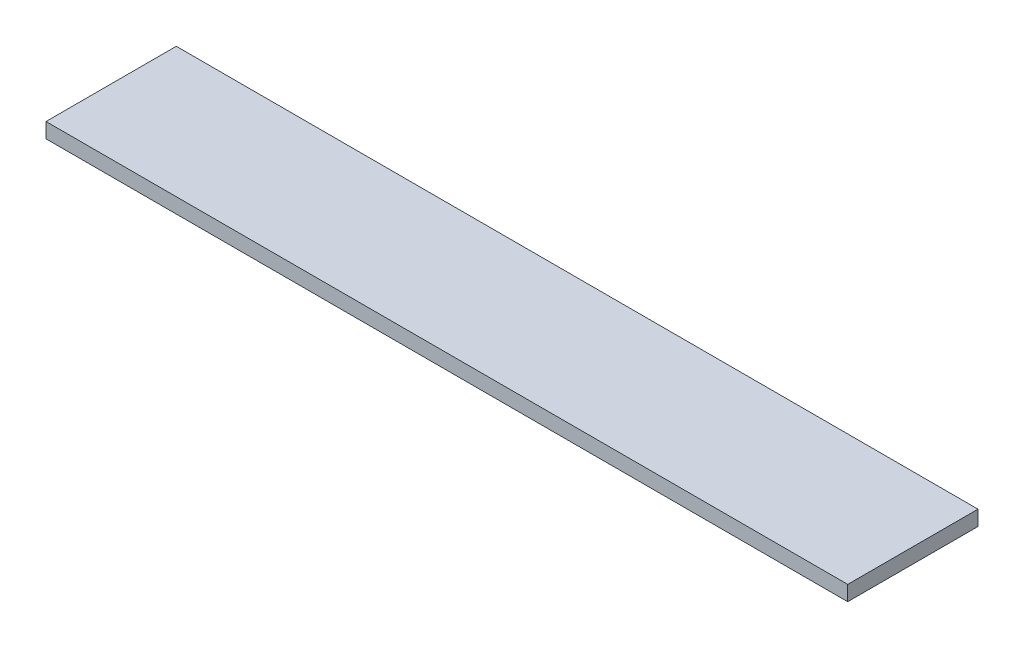
ISO-10303-21;
HEADER;
FILE_DESCRIPTION(('STEP AP214'),'2;1');
FILE_NAME('part.step','',(''),(''),'','','');
FILE_SCHEMA(('AUTOMOTIVE_DESIGN { 1 0 10303 214 1 1 1 1 }'));
ENDSEC;
DATA;
#1=APPLICATION_CONTEXT('core data for automotive mechanical design processes');
#2=APPLICATION_PROTOCOL_DEFINITION('international standard','automotive_design',2000,#1);
#3=PRODUCT_CONTEXT('',#1,'mechanical');
#4=PRODUCT('Part','Part','',(#3));
#5=PRODUCT_RELATED_PRODUCT_CATEGORY('part','',(#4));
#6=PRODUCT_DEFINITION_FORMATION('','',#4);
#7=PRODUCT_DEFINITION_CONTEXT('part definition',#1,'design');
#8=PRODUCT_DEFINITION('design','',#6,#7);
#9=PRODUCT_DEFINITION_SHAPE('','',#8);
#10=(LENGTH_UNIT() NAMED_UNIT(*) SI_UNIT(.MILLI.,.METRE.));
#11=(NAMED_UNIT(*) PLANE_ANGLE_UNIT() SI_UNIT($,.RADIAN.));
#12=(NAMED_UNIT(*) SI_UNIT($,.STERADIAN.) SOLID_ANGLE_UNIT());
#13=UNCERTAINTY_MEASURE_WITH_UNIT(LENGTH_MEASURE(1.E-05),#10,'distance_accuracy_value','');
#14=(GEOMETRIC_REPRESENTATION_CONTEXT(3) GLOBAL_UNCERTAINTY_ASSIGNED_CONTEXT((#13)) GLOBAL_UNIT_ASSIGNED_CONTEXT((#10,
#11,#12)) REPRESENTATION_CONTEXT('',''));
#15=CARTESIAN_POINT('',(0.,0.,0.));
#16=DIRECTION('',(0.,0.,1.));
#17=DIRECTION('',(1.,0.,0.));
#18=AXIS2_PLACEMENT_3D('',#15,#16,#17);
#19=CARTESIAN_POINT('',(-143.80515849099,19.05,936.480181370769));
#20=DIRECTION('',(1.,0.,0.));
#21=DIRECTION('',(0.,0.,-1.));
#22=AXIS2_PLACEMENT_3D('',#19,#20,#21);
#23=PLANE('',#22);
#24=DIRECTION('',(0.,0.,1.));
#25=VECTOR('',#24,1.);
#26=CARTESIAN_POINT('',(-143.80515849099,0.,936.480181370769));
#27=LINE('',#26,#25);
#28=CARTESIAN_POINT('',(-143.80515849099,0.,771.380181370769));
#29=VERTEX_POINT('',#28);
#30=CARTESIAN_POINT('',(-143.80515849099,0.,936.480181370769));
#31=VERTEX_POINT('',#30);
#32=EDGE_CURVE('E99',#29,#31,#27,.T.);
#33=ORIENTED_EDGE('',*,*,#32,.T.);
#34=DIRECTION('',(0.,-1.,0.));
#35=VECTOR('',#34,1.);
#36=CARTESIAN_POINT('',(-143.80515849099,19.05,936.480181370769));
#37=LINE('',#36,#35);
#38=CARTESIAN_POINT('',(-143.80515849099,19.05,936.480181370769));
#39=VERTEX_POINT('',#38);
#40=EDGE_CURVE('E11',#39,#31,#37,.T.);
#41=ORIENTED_EDGE('',*,*,#40,.F.);
#42=DIRECTION('',(0.,0.,1.));
#43=VECTOR('',#42,1.);
#44=CARTESIAN_POINT('',(-143.80515849099,19.05,936.480181370769));
#45=LINE('',#44,#43);
#46=CARTESIAN_POINT('',(-143.80515849099,19.05,771.380181370769));
#47=VERTEX_POINT('',#46);
#48=EDGE_CURVE('E86',#47,#39,#45,.T.);
#49=ORIENTED_EDGE('',*,*,#48,.F.);
#50=DIRECTION('',(0.,-1.,0.));
#51=VECTOR('',#50,1.);
#52=CARTESIAN_POINT('',(-143.80515849099,19.05,771.380181370769));
#53=LINE('',#52,#51);
#54=EDGE_CURVE('E95',#47,#29,#53,.T.);
#55=ORIENTED_EDGE('',*,*,#54,.T.);
#56=EDGE_LOOP('',(#33,#41,#49,#55));
#57=FACE_BOUND('',#56,.T.);
#58=ADVANCED_FACE('F34',(#57),#23,.F.);
#59=CARTESIAN_POINT('',(-143.80515849099,19.05,936.480181370769));
#60=DIRECTION('',(0.,0.,-1.));
#61=DIRECTION('',(-1.,0.,0.));
#62=AXIS2_PLACEMENT_3D('',#59,#60,#61);
#63=PLANE('',#62);
#64=DIRECTION('',(1.,0.,0.));
#65=VECTOR('',#64,1.);
#66=CARTESIAN_POINT('',(-143.80515849099,0.,936.480181370769));
#67=LINE('',#66,#65);
#68=CARTESIAN_POINT('',(872.19484150901,0.,936.480181370769));
#69=VERTEX_POINT('',#68);
#70=EDGE_CURVE('E90',#31,#69,#67,.T.);
#71=ORIENTED_EDGE('',*,*,#70,.T.);
#72=DIRECTION('',(0.,-1.,0.));
#73=VECTOR('',#72,1.);
#74=CARTESIAN_POINT('',(872.19484150901,19.05,936.480181370769));
#75=LINE('',#74,#73);
#76=CARTESIAN_POINT('',(872.19484150901,19.05,936.480181370769));
#77=VERTEX_POINT('',#76);
#78=EDGE_CURVE('E43',#77,#69,#75,.T.);
#79=ORIENTED_EDGE('',*,*,#78,.F.);
#80=DIRECTION('',(1.,0.,0.));
#81=VECTOR('',#80,1.);
#82=CARTESIAN_POINT('',(-143.80515849099,19.05,936.480181370769));
#83=LINE('',#82,#81);
#84=EDGE_CURVE('E81',#39,#77,#83,.T.);
#85=ORIENTED_EDGE('',*,*,#84,.F.);
#86=ORIENTED_EDGE('',*,*,#40,.T.);
#87=EDGE_LOOP('',(#71,#79,#85,#86));
#88=FACE_BOUND('',#87,.T.);
#89=ADVANCED_FACE('F89',(#88),#63,.F.);
#90=CARTESIAN_POINT('',(872.19484150901,19.05,936.480181370769));
#91=DIRECTION('',(-1.,0.,0.));
#92=DIRECTION('',(0.,0.,1.));
#93=AXIS2_PLACEMENT_3D('',#90,#91,#92);
#94=PLANE('',#93);
#95=DIRECTION('',(0.,0.,-1.));
#96=VECTOR('',#95,1.);
#97=CARTESIAN_POINT('',(872.19484150901,0.,936.480181370769));
#98=LINE('',#97,#96);
#99=CARTESIAN_POINT('',(872.19484150901,0.,771.380181370769));
#100=VERTEX_POINT('',#99);
#101=EDGE_CURVE('E68',#69,#100,#98,.T.);
#102=ORIENTED_EDGE('',*,*,#101,.T.);
#103=DIRECTION('',(0.,-1.,0.));
#104=VECTOR('',#103,1.);
#105=CARTESIAN_POINT('',(872.19484150901,19.05,771.380181370769));
#106=LINE('',#105,#104);
#107=CARTESIAN_POINT('',(872.19484150901,19.05,771.380181370769));
#108=VERTEX_POINT('',#107);
#109=EDGE_CURVE('E91',#108,#100,#106,.T.);
#110=ORIENTED_EDGE('',*,*,#109,.F.);
#111=DIRECTION('',(0.,0.,-1.));
#112=VECTOR('',#111,1.);
#113=CARTESIAN_POINT('',(872.19484150901,19.05,936.480181370769));
#114=LINE('',#113,#112);
#115=EDGE_CURVE('E84',#77,#108,#114,.T.);
#116=ORIENTED_EDGE('',*,*,#115,.F.);
#117=ORIENTED_EDGE('',*,*,#78,.T.);
#118=EDGE_LOOP('',(#102,#110,#116,#117));
#119=FACE_BOUND('',#118,.T.);
#120=ADVANCED_FACE('F92',(#119),#94,.F.);
#121=CARTESIAN_POINT('',(-143.80515849099,19.05,771.380181370769));
#122=DIRECTION('',(0.,0.,1.));
#123=DIRECTION('',(1.,0.,0.));
#124=AXIS2_PLACEMENT_3D('',#121,#122,#123);
#125=PLANE('',#124);
#126=DIRECTION('',(-1.,0.,0.));
#127=VECTOR('',#126,1.);
#128=CARTESIAN_POINT('',(-143.80515849099,0.,771.380181370769));
#129=LINE('',#128,#127);
#130=EDGE_CURVE('E74',#100,#29,#129,.T.);
#131=ORIENTED_EDGE('',*,*,#130,.T.);
#132=ORIENTED_EDGE('',*,*,#54,.F.);
#133=DIRECTION('',(-1.,0.,0.));
#134=VECTOR('',#133,1.);
#135=CARTESIAN_POINT('',(-143.80515849099,19.05,771.380181370769));
#136=LINE('',#135,#134);
#137=EDGE_CURVE('E51',#108,#47,#136,.T.);
#138=ORIENTED_EDGE('',*,*,#137,.F.);
#139=ORIENTED_EDGE('',*,*,#109,.T.);
#140=EDGE_LOOP('',(#131,#132,#138,#139));
#141=FACE_BOUND('',#140,.T.);
#142=ADVANCED_FACE('F110',(#141),#125,.F.);
#143=CARTESIAN_POINT('',(0.,19.05,0.));
#144=DIRECTION('',(0.,-1.,0.));
#145=DIRECTION('',(0.,0.,-1.));
#146=AXIS2_PLACEMENT_3D('',#143,#144,#145);
#147=PLANE('',#146);
#148=ORIENTED_EDGE('',*,*,#48,.T.);
#149=ORIENTED_EDGE('',*,*,#84,.T.);
#150=ORIENTED_EDGE('',*,*,#115,.T.);
#151=ORIENTED_EDGE('',*,*,#137,.T.);
#152=EDGE_LOOP('',(#148,#149,#150,#151));
#153=FACE_BOUND('',#152,.T.);
#154=ADVANCED_FACE('F82',(#153),#147,.F.);
#155=CARTESIAN_POINT('',(0.,0.,0.));
#156=DIRECTION('',(0.,-1.,0.));
#157=DIRECTION('',(0.,0.,-1.));
#158=AXIS2_PLACEMENT_3D('',#155,#156,#157);
#159=PLANE('',#158);
#160=ORIENTED_EDGE('',*,*,#32,.F.);
#161=ORIENTED_EDGE('',*,*,#130,.F.);
#162=ORIENTED_EDGE('',*,*,#101,.F.);
#163=ORIENTED_EDGE('',*,*,#70,.F.);
#164=EDGE_LOOP('',(#160,#161,#162,#163));
#165=FACE_BOUND('',#164,.T.);
#166=ADVANCED_FACE('F113',(#165),#159,.T.);
#167=CLOSED_SHELL('',(#58,#89,#120,#142,#154,#166));
#168=MANIFOLD_SOLID_BREP('B2',#167);
#169=ADVANCED_BREP_SHAPE_REPRESENTATION('',(#18,#168),#14);
#170=SHAPE_DEFINITION_REPRESENTATION(#9,#169);
ENDSEC;
END-ISO-10303-21;
